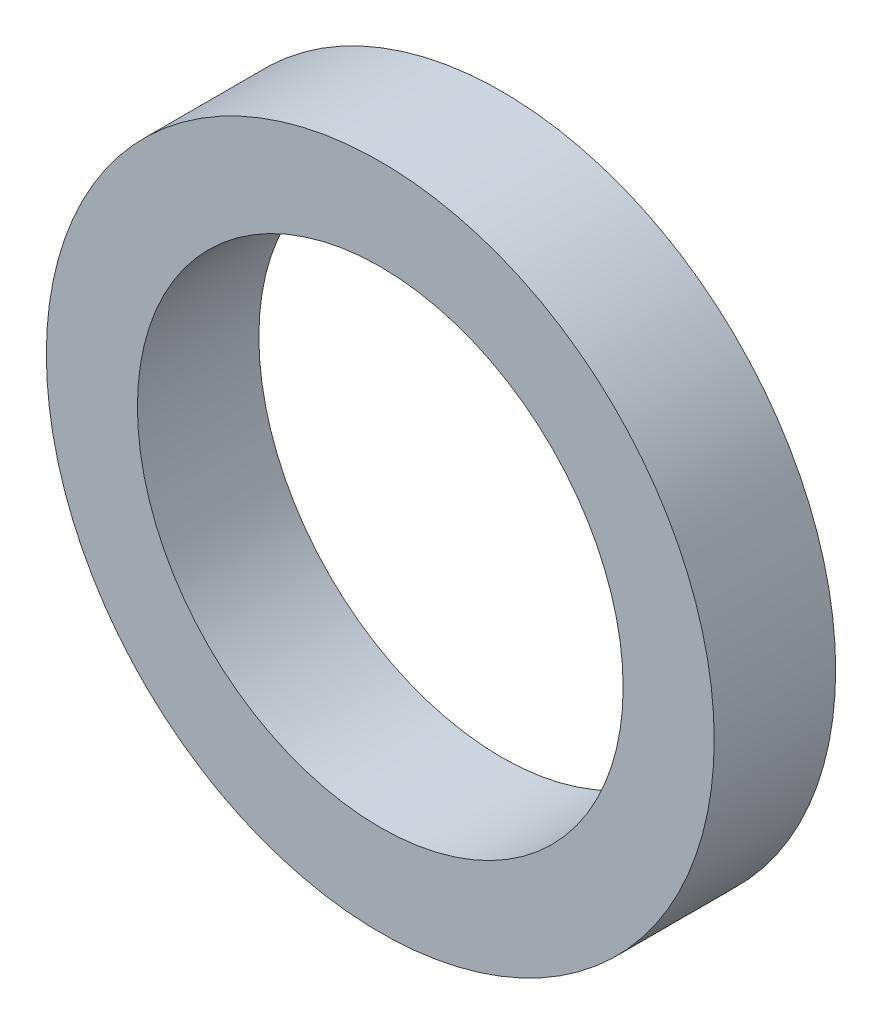
ISO-10303-21;
HEADER;
FILE_DESCRIPTION(('STEP AP214'),'2;1');
FILE_NAME('part.step','',(''),(''),'','','');
FILE_SCHEMA(('AUTOMOTIVE_DESIGN { 1 0 10303 214 1 1 1 1 }'));
ENDSEC;
DATA;
#1=APPLICATION_CONTEXT('core data for automotive mechanical design processes');
#2=APPLICATION_PROTOCOL_DEFINITION('international standard','automotive_design',2000,#1);
#3=PRODUCT_CONTEXT('',#1,'mechanical');
#4=PRODUCT('Part','Part','',(#3));
#5=PRODUCT_RELATED_PRODUCT_CATEGORY('part','',(#4));
#6=PRODUCT_DEFINITION_FORMATION('','',#4);
#7=PRODUCT_DEFINITION_CONTEXT('part definition',#1,'design');
#8=PRODUCT_DEFINITION('design','',#6,#7);
#9=PRODUCT_DEFINITION_SHAPE('','',#8);
#10=(LENGTH_UNIT() NAMED_UNIT(*) SI_UNIT(.MILLI.,.METRE.));
#11=(NAMED_UNIT(*) PLANE_ANGLE_UNIT() SI_UNIT($,.RADIAN.));
#12=(NAMED_UNIT(*) SI_UNIT($,.STERADIAN.) SOLID_ANGLE_UNIT());
#13=UNCERTAINTY_MEASURE_WITH_UNIT(LENGTH_MEASURE(1.E-05),#10,'distance_accuracy_value','');
#14=(GEOMETRIC_REPRESENTATION_CONTEXT(3) GLOBAL_UNCERTAINTY_ASSIGNED_CONTEXT((#13)) GLOBAL_UNIT_ASSIGNED_CONTEXT((#10,
#11,#12)) REPRESENTATION_CONTEXT('',''));
#15=CARTESIAN_POINT('',(0.,0.,0.));
#16=DIRECTION('',(0.,0.,1.));
#17=DIRECTION('',(1.,0.,0.));
#18=AXIS2_PLACEMENT_3D('',#15,#16,#17);
#19=CARTESIAN_POINT('',(0.,0.,4.));
#20=DIRECTION('',(0.,0.,1.));
#21=DIRECTION('',(1.,0.,0.));
#22=AXIS2_PLACEMENT_3D('',#19,#20,#21);
#23=PLANE('',#22);
#24=CARTESIAN_POINT('',(0.,0.,4.));
#25=DIRECTION('',(0.,0.,1.));
#26=DIRECTION('',(1.,0.,0.));
#27=AXIS2_PLACEMENT_3D('',#24,#25,#26);
#28=CIRCLE('',#27,11.);
#29=CARTESIAN_POINT('',(11.,0.,4.));
#30=VERTEX_POINT('',#29);
#31=EDGE_CURVE('E10',#30,#30,#28,.T.);
#32=ORIENTED_EDGE('',*,*,#31,.T.);
#33=EDGE_LOOP('',(#32));
#34=FACE_BOUND('',#33,.T.);
#35=CARTESIAN_POINT('',(0.,0.,4.));
#36=DIRECTION('',(0.,0.,1.));
#37=DIRECTION('',(1.,0.,0.));
#38=AXIS2_PLACEMENT_3D('',#35,#36,#37);
#39=CIRCLE('',#38,8.);
#40=CARTESIAN_POINT('',(8.,0.,4.));
#41=VERTEX_POINT('',#40);
#42=EDGE_CURVE('E45',#41,#41,#39,.T.);
#43=ORIENTED_EDGE('',*,*,#42,.F.);
#44=EDGE_LOOP('',(#43));
#45=FACE_BOUND('',#44,.T.);
#46=ADVANCED_FACE('F34',(#34,#45),#23,.T.);
#47=CARTESIAN_POINT('',(0.,0.,0.));
#48=DIRECTION('',(0.,0.,1.));
#49=DIRECTION('',(1.,0.,0.));
#50=AXIS2_PLACEMENT_3D('',#47,#48,#49);
#51=PLANE('',#50);
#52=CARTESIAN_POINT('',(0.,0.,0.));
#53=DIRECTION('',(0.,0.,1.));
#54=DIRECTION('',(1.,0.,0.));
#55=AXIS2_PLACEMENT_3D('',#52,#53,#54);
#56=CIRCLE('',#55,11.);
#57=CARTESIAN_POINT('',(11.,0.,0.));
#58=VERTEX_POINT('',#57);
#59=EDGE_CURVE('E38',#58,#58,#56,.T.);
#60=ORIENTED_EDGE('',*,*,#59,.F.);
#61=EDGE_LOOP('',(#60));
#62=FACE_BOUND('',#61,.T.);
#63=CARTESIAN_POINT('',(0.,0.,0.));
#64=DIRECTION('',(0.,0.,1.));
#65=DIRECTION('',(1.,0.,0.));
#66=AXIS2_PLACEMENT_3D('',#63,#64,#65);
#67=CIRCLE('',#66,8.);
#68=CARTESIAN_POINT('',(8.,0.,0.));
#69=VERTEX_POINT('',#68);
#70=EDGE_CURVE('E47',#69,#69,#67,.T.);
#71=ORIENTED_EDGE('',*,*,#70,.T.);
#72=EDGE_LOOP('',(#71));
#73=FACE_BOUND('',#72,.T.);
#74=ADVANCED_FACE('F57',(#62,#73),#51,.F.);
#75=CARTESIAN_POINT('',(0.,0.,4.));
#76=DIRECTION('',(0.,0.,-1.));
#77=DIRECTION('',(-1.,0.,0.));
#78=AXIS2_PLACEMENT_3D('',#75,#76,#77);
#79=CYLINDRICAL_SURFACE('',#78,11.);
#80=ORIENTED_EDGE('',*,*,#31,.F.);
#81=EDGE_LOOP('',(#80));
#82=FACE_BOUND('',#81,.T.);
#83=ORIENTED_EDGE('',*,*,#59,.T.);
#84=EDGE_LOOP('',(#83));
#85=FACE_BOUND('',#84,.T.);
#86=ADVANCED_FACE('F36',(#82,#85),#79,.T.);
#87=CARTESIAN_POINT('',(0.,0.,4.));
#88=DIRECTION('',(0.,0.,-1.));
#89=DIRECTION('',(-1.,0.,0.));
#90=AXIS2_PLACEMENT_3D('',#87,#88,#89);
#91=CYLINDRICAL_SURFACE('',#90,8.);
#92=ORIENTED_EDGE('',*,*,#42,.T.);
#93=EDGE_LOOP('',(#92));
#94=FACE_BOUND('',#93,.T.);
#95=ORIENTED_EDGE('',*,*,#70,.F.);
#96=EDGE_LOOP('',(#95));
#97=FACE_BOUND('',#96,.T.);
#98=ADVANCED_FACE('F53',(#94,#97),#91,.F.);
#99=CLOSED_SHELL('',(#46,#74,#86,#98));
#100=MANIFOLD_SOLID_BREP('B2',#99);
#101=ADVANCED_BREP_SHAPE_REPRESENTATION('',(#18,#100),#14);
#102=SHAPE_DEFINITION_REPRESENTATION(#9,#101);
ENDSEC;
END-ISO-10303-21;
